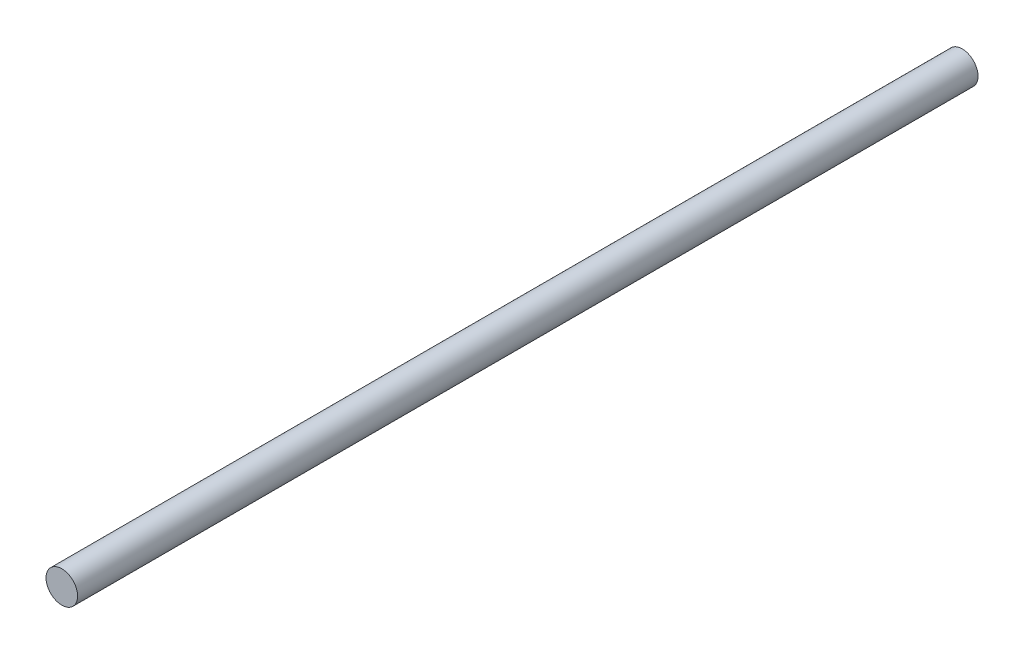
ISO-10303-21;
HEADER;
FILE_DESCRIPTION(('STEP AP214'),'2;1');
FILE_NAME('part.step','',(''),(''),'','','');
FILE_SCHEMA(('AUTOMOTIVE_DESIGN { 1 0 10303 214 1 1 1 1 }'));
ENDSEC;
DATA;
#1=APPLICATION_CONTEXT('core data for automotive mechanical design processes');
#2=APPLICATION_PROTOCOL_DEFINITION('international standard','automotive_design',2000,#1);
#3=PRODUCT_CONTEXT('',#1,'mechanical');
#4=PRODUCT('Part','Part','',(#3));
#5=PRODUCT_RELATED_PRODUCT_CATEGORY('part','',(#4));
#6=PRODUCT_DEFINITION_FORMATION('','',#4);
#7=PRODUCT_DEFINITION_CONTEXT('part definition',#1,'design');
#8=PRODUCT_DEFINITION('design','',#6,#7);
#9=PRODUCT_DEFINITION_SHAPE('','',#8);
#10=(LENGTH_UNIT() NAMED_UNIT(*) SI_UNIT(.MILLI.,.METRE.));
#11=(NAMED_UNIT(*) PLANE_ANGLE_UNIT() SI_UNIT($,.RADIAN.));
#12=(NAMED_UNIT(*) SI_UNIT($,.STERADIAN.) SOLID_ANGLE_UNIT());
#13=UNCERTAINTY_MEASURE_WITH_UNIT(LENGTH_MEASURE(1.E-05),#10,'distance_accuracy_value','');
#14=(GEOMETRIC_REPRESENTATION_CONTEXT(3) GLOBAL_UNCERTAINTY_ASSIGNED_CONTEXT((#13)) GLOBAL_UNIT_ASSIGNED_CONTEXT((#10,
#11,#12)) REPRESENTATION_CONTEXT('',''));
#15=CARTESIAN_POINT('',(0.,0.,0.));
#16=DIRECTION('',(0.,0.,1.));
#17=DIRECTION('',(1.,0.,0.));
#18=AXIS2_PLACEMENT_3D('',#15,#16,#17);
#19=CARTESIAN_POINT('',(0.,0.,228.));
#20=DIRECTION('',(0.,0.,-1.));
#21=DIRECTION('',(-1.,0.,0.));
#22=AXIS2_PLACEMENT_3D('',#19,#20,#21);
#23=CYLINDRICAL_SURFACE('',#22,4.);
#24=CARTESIAN_POINT('',(0.,0.,228.));
#25=DIRECTION('',(0.,0.,1.));
#26=DIRECTION('',(1.,0.,0.));
#27=AXIS2_PLACEMENT_3D('',#24,#25,#26);
#28=CIRCLE('',#27,4.);
#29=CARTESIAN_POINT('',(-4.,0.,228.));
#30=VERTEX_POINT('',#29);
#31=EDGE_CURVE('E10',#30,#30,#28,.T.);
#32=CARTESIAN_POINT('',(0.,0.,0.));
#33=DIRECTION('',(0.,0.,1.));
#34=DIRECTION('',(1.,0.,0.));
#35=AXIS2_PLACEMENT_3D('',#32,#33,#34);
#36=CIRCLE('',#35,4.);
#37=CARTESIAN_POINT('',(-4.,0.,0.));
#38=VERTEX_POINT('',#37);
#39=EDGE_CURVE('E36',#38,#38,#36,.T.);
#40=CARTESIAN_POINT('',(-4.,0.,228.));
#41=CARTESIAN_POINT('',(-4.,0.,225.625));
#42=CARTESIAN_POINT('',(-4.,0.,223.25));
#43=CARTESIAN_POINT('',(-4.,0.,218.5));
#44=CARTESIAN_POINT('',(-4.,0.,216.125));
#45=CARTESIAN_POINT('',(-4.,0.,211.375));
#46=CARTESIAN_POINT('',(-4.,0.,209.));
#47=CARTESIAN_POINT('',(-4.,0.,204.25));
#48=CARTESIAN_POINT('',(-4.,0.,201.875));
#49=CARTESIAN_POINT('',(-4.,0.,197.125));
#50=CARTESIAN_POINT('',(-4.,0.,194.75));
#51=CARTESIAN_POINT('',(-4.,0.,190.));
#52=CARTESIAN_POINT('',(-4.,0.,187.625));
#53=CARTESIAN_POINT('',(-4.,0.,182.875));
#54=CARTESIAN_POINT('',(-4.,0.,180.5));
#55=CARTESIAN_POINT('',(-4.,0.,175.75));
#56=CARTESIAN_POINT('',(-4.,0.,173.375));
#57=CARTESIAN_POINT('',(-4.,0.,168.625));
#58=CARTESIAN_POINT('',(-4.,0.,166.25));
#59=CARTESIAN_POINT('',(-4.,0.,161.5));
#60=CARTESIAN_POINT('',(-4.,0.,159.125));
#61=CARTESIAN_POINT('',(-4.,0.,154.375));
#62=CARTESIAN_POINT('',(-4.,0.,152.));
#63=CARTESIAN_POINT('',(-4.,0.,147.25));
#64=CARTESIAN_POINT('',(-4.,0.,144.875));
#65=CARTESIAN_POINT('',(-4.,0.,140.125));
#66=CARTESIAN_POINT('',(-4.,0.,137.75));
#67=CARTESIAN_POINT('',(-4.,0.,133.));
#68=CARTESIAN_POINT('',(-4.,0.,130.625));
#69=CARTESIAN_POINT('',(-4.,0.,125.875));
#70=CARTESIAN_POINT('',(-4.,0.,123.5));
#71=CARTESIAN_POINT('',(-4.,0.,118.75));
#72=CARTESIAN_POINT('',(-4.,0.,116.375));
#73=CARTESIAN_POINT('',(-4.,0.,111.625));
#74=CARTESIAN_POINT('',(-4.,0.,109.25));
#75=CARTESIAN_POINT('',(-4.,0.,104.5));
#76=CARTESIAN_POINT('',(-4.,0.,102.125));
#77=CARTESIAN_POINT('',(-4.,0.,97.375));
#78=CARTESIAN_POINT('',(-4.,0.,95.));
#79=CARTESIAN_POINT('',(-4.,0.,90.25));
#80=CARTESIAN_POINT('',(-4.,0.,87.875));
#81=CARTESIAN_POINT('',(-4.,0.,83.125));
#82=CARTESIAN_POINT('',(-4.,0.,80.75));
#83=CARTESIAN_POINT('',(-4.,0.,76.));
#84=CARTESIAN_POINT('',(-4.,0.,73.625));
#85=CARTESIAN_POINT('',(-4.,0.,68.875));
#86=CARTESIAN_POINT('',(-4.,0.,66.5));
#87=CARTESIAN_POINT('',(-4.,0.,61.75));
#88=CARTESIAN_POINT('',(-4.,0.,59.375));
#89=CARTESIAN_POINT('',(-4.,0.,54.625));
#90=CARTESIAN_POINT('',(-4.,0.,52.25));
#91=CARTESIAN_POINT('',(-4.,0.,47.5));
#92=CARTESIAN_POINT('',(-4.,0.,45.125));
#93=CARTESIAN_POINT('',(-4.,0.,40.375));
#94=CARTESIAN_POINT('',(-4.,0.,38.));
#95=CARTESIAN_POINT('',(-4.,0.,33.25));
#96=CARTESIAN_POINT('',(-4.,0.,30.875));
#97=CARTESIAN_POINT('',(-4.,0.,26.125));
#98=CARTESIAN_POINT('',(-4.,0.,23.75));
#99=CARTESIAN_POINT('',(-4.,0.,19.));
#100=CARTESIAN_POINT('',(-4.,0.,16.625));
#101=CARTESIAN_POINT('',(-4.,0.,11.875));
#102=CARTESIAN_POINT('',(-4.,0.,9.5));
#103=CARTESIAN_POINT('',(-4.,0.,4.75));
#104=CARTESIAN_POINT('',(-4.,0.,2.375));
#105=CARTESIAN_POINT('',(-4.,0.,0.));
#106=B_SPLINE_CURVE_WITH_KNOTS('',3,(#40,#41,#42,#43,#44,#45,#46,#47,#48,#49,#50,#51,#52,#53,
#54,#55,#56,#57,#58,#59,#60,#61,#62,#63,#64,#65,#66,#67,#68,#69,#70,#71,#72,#73,#74,#75,#76,#77,
#78,#79,#80,#81,#82,#83,#84,#85,#86,#87,#88,#89,#90,#91,#92,#93,#94,#95,#96,#97,#98,#99,#100,
#101,#102,#103,#104,#105),.UNSPECIFIED.,.F.,.F.,(4,2,2,2,2,2,2,2,2,2,2,2,2,2,2,2,2,2,2,2,2,2,2,
2,2,2,2,2,2,2,2,2,4),(0.,7.12499999999999,14.25,21.375,28.5,35.625,42.75,49.875,57.,64.125,
71.25,78.375,85.5,92.625,99.75,106.875,114.,121.125,128.25,135.375,142.5,149.625,156.75,163.875,
171.,178.125,185.25,192.375,199.5,206.625,213.75,220.875,228.),.UNSPECIFIED.);
#107=EDGE_CURVE('BSEAM33',#30,#38,#106,.T.);
#108=ORIENTED_EDGE('',*,*,#31,.F.);
#109=ORIENTED_EDGE('',*,*,#39,.T.);
#110=ORIENTED_EDGE('',*,*,#107,.T.);
#111=ORIENTED_EDGE('',*,*,#107,.F.);
#112=EDGE_LOOP('',(#108,#110,#109,#111));
#113=FACE_BOUND('',#112,.T.);
#114=ADVANCED_FACE('F33',(#113),#23,.T.);
#115=CARTESIAN_POINT('',(0.,0.,228.));
#116=DIRECTION('',(0.,0.,1.));
#117=DIRECTION('',(1.,0.,0.));
#118=AXIS2_PLACEMENT_3D('',#115,#116,#117);
#119=PLANE('',#118);
#120=ORIENTED_EDGE('',*,*,#31,.T.);
#121=EDGE_LOOP('',(#120));
#122=FACE_BOUND('',#121,.T.);
#123=ADVANCED_FACE('F48',(#122),#119,.T.);
#124=CARTESIAN_POINT('',(0.,0.,0.));
#125=DIRECTION('',(0.,0.,1.));
#126=DIRECTION('',(1.,0.,0.));
#127=AXIS2_PLACEMENT_3D('',#124,#125,#126);
#128=PLANE('',#127);
#129=ORIENTED_EDGE('',*,*,#39,.F.);
#130=EDGE_LOOP('',(#129));
#131=FACE_BOUND('',#130,.T.);
#132=ADVANCED_FACE('F46',(#131),#128,.F.);
#133=CLOSED_SHELL('',(#114,#123,#132));
#134=MANIFOLD_SOLID_BREP('B2',#133);
#135=ADVANCED_BREP_SHAPE_REPRESENTATION('',(#18,#134),#14);
#136=SHAPE_DEFINITION_REPRESENTATION(#9,#135);
ENDSEC;
END-ISO-10303-21;
